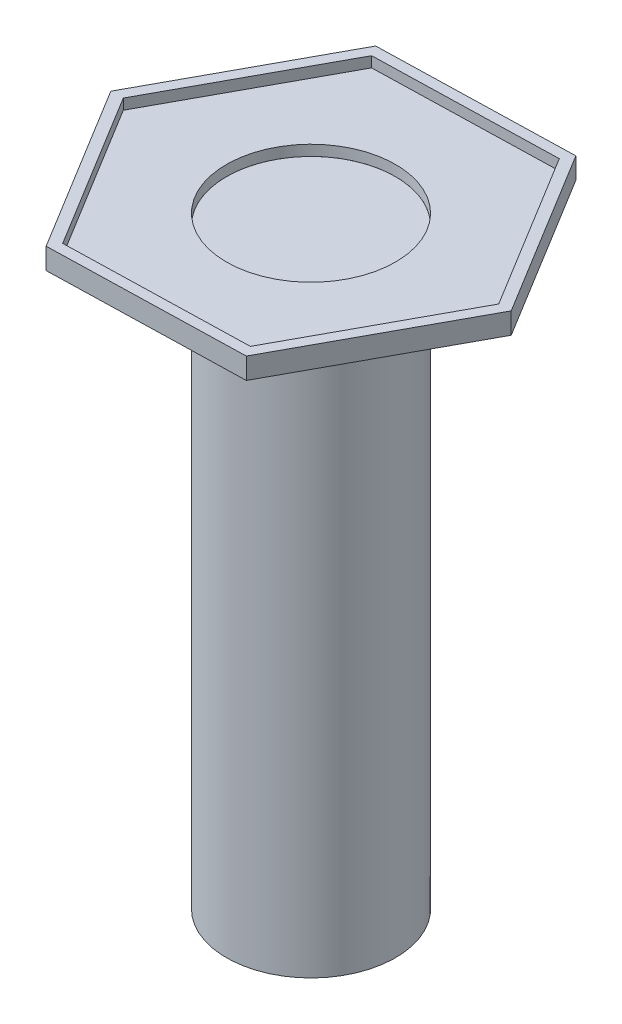
ISO-10303-21;
HEADER;
FILE_DESCRIPTION(('STEP AP214'),'2;1');
FILE_NAME('part.step','',(''),(''),'','','');
FILE_SCHEMA(('AUTOMOTIVE_DESIGN { 1 0 10303 214 1 1 1 1 }'));
ENDSEC;
DATA;
#1=APPLICATION_CONTEXT('core data for automotive mechanical design processes');
#2=APPLICATION_PROTOCOL_DEFINITION('international standard','automotive_design',2000,#1);
#3=PRODUCT_CONTEXT('',#1,'mechanical');
#4=PRODUCT('Part','Part','',(#3));
#5=PRODUCT_RELATED_PRODUCT_CATEGORY('part','',(#4));
#6=PRODUCT_DEFINITION_FORMATION('','',#4);
#7=PRODUCT_DEFINITION_CONTEXT('part definition',#1,'design');
#8=PRODUCT_DEFINITION('design','',#6,#7);
#9=PRODUCT_DEFINITION_SHAPE('','',#8);
#10=(LENGTH_UNIT() NAMED_UNIT(*) SI_UNIT(.MILLI.,.METRE.));
#11=(NAMED_UNIT(*) PLANE_ANGLE_UNIT() SI_UNIT($,.RADIAN.));
#12=(NAMED_UNIT(*) SI_UNIT($,.STERADIAN.) SOLID_ANGLE_UNIT());
#13=UNCERTAINTY_MEASURE_WITH_UNIT(LENGTH_MEASURE(1.E-05),#10,'distance_accuracy_value','');
#14=(GEOMETRIC_REPRESENTATION_CONTEXT(3) GLOBAL_UNCERTAINTY_ASSIGNED_CONTEXT((#13)) GLOBAL_UNIT_ASSIGNED_CONTEXT((#10,
#11,#12)) REPRESENTATION_CONTEXT('',''));
#15=CARTESIAN_POINT('',(0.,0.,0.));
#16=DIRECTION('',(0.,0.,1.));
#17=DIRECTION('',(1.,0.,0.));
#18=AXIS2_PLACEMENT_3D('',#15,#16,#17);
#19=CARTESIAN_POINT('',(0.,-14.,0.));
#20=DIRECTION('',(0.,1.,0.));
#21=DIRECTION('',(0.,0.,1.));
#22=AXIS2_PLACEMENT_3D('',#19,#20,#21);
#23=CYLINDRICAL_SURFACE('',#22,2.);
#24=CARTESIAN_POINT('',(0.,-14.,0.));
#25=DIRECTION('',(0.,-1.,0.));
#26=DIRECTION('',(0.,0.,-1.));
#27=AXIS2_PLACEMENT_3D('',#24,#25,#26);
#28=CIRCLE('',#27,2.);
#29=CARTESIAN_POINT('',(0.,-14.,-2.));
#30=VERTEX_POINT('',#29);
#31=EDGE_CURVE('E11',#30,#30,#28,.T.);
#32=ORIENTED_EDGE('',*,*,#31,.F.);
#33=EDGE_LOOP('',(#32));
#34=FACE_BOUND('',#33,.T.);
#35=CARTESIAN_POINT('',(0.,0.,0.));
#36=DIRECTION('',(0.,-1.,0.));
#37=DIRECTION('',(0.,0.,-1.));
#38=AXIS2_PLACEMENT_3D('',#35,#36,#37);
#39=CIRCLE('',#38,2.);
#40=CARTESIAN_POINT('',(0.,0.,-2.));
#41=VERTEX_POINT('',#40);
#42=EDGE_CURVE('E49',#41,#41,#39,.T.);
#43=ORIENTED_EDGE('',*,*,#42,.T.);
#44=EDGE_LOOP('',(#43));
#45=FACE_BOUND('',#44,.T.);
#46=ADVANCED_FACE('F46',(#34,#45),#23,.T.);
#47=CARTESIAN_POINT('',(0.,-14.,0.));
#48=DIRECTION('',(0.,-1.,0.));
#49=DIRECTION('',(0.,0.,-1.));
#50=AXIS2_PLACEMENT_3D('',#47,#48,#49);
#51=PLANE('',#50);
#52=ORIENTED_EDGE('',*,*,#31,.T.);
#53=EDGE_LOOP('',(#52));
#54=FACE_BOUND('',#53,.T.);
#55=ADVANCED_FACE('F61',(#54),#51,.T.);
#56=CARTESIAN_POINT('',(0.,0.,0.));
#57=DIRECTION('',(0.,-1.,0.));
#58=DIRECTION('',(0.,0.,-1.));
#59=AXIS2_PLACEMENT_3D('',#56,#57,#58);
#60=PLANE('',#59);
#61=ORIENTED_EDGE('',*,*,#42,.F.);
#62=EDGE_LOOP('',(#61));
#63=FACE_BOUND('',#62,.T.);
#64=ADVANCED_FACE('F59',(#63),#60,.F.);
#65=CLOSED_SHELL('',(#46,#55,#64));
#66=MANIFOLD_SOLID_BREP('B2',#65);
#67=CARTESIAN_POINT('',(2.2066429013016,0.5,-4.05759293663973));
#68=DIRECTION('',(0.025501776174238,0.,0.999674776820921));
#69=DIRECTION('',(0.999674776820921,0.,-0.025501776174238));
#70=AXIS2_PLACEMENT_3D('',#67,#68,#69);
#71=PLANE('',#70);
#72=DIRECTION('',(-0.999674776820922,0.,0.025501776174238));
#73=VECTOR('',#72,1.);
#74=CARTESIAN_POINT('',(2.2066429013016,0.,-4.05759293663973));
#75=LINE('',#74,#73);
#76=CARTESIAN_POINT('',(2.2066429013016,0.,-4.05759293663973));
#77=VERTEX_POINT('',#76);
#78=CARTESIAN_POINT('',(-2.41065711069551,0.,-3.93980527792765));
#79=VERTEX_POINT('',#78);
#80=EDGE_CURVE('E184',#77,#79,#75,.T.);
#81=ORIENTED_EDGE('',*,*,#80,.T.);
#82=DIRECTION('',(0.,-1.,0.));
#83=VECTOR('',#82,1.);
#84=CARTESIAN_POINT('',(-2.41065711069551,0.5,-3.93980527792765));
#85=LINE('',#84,#83);
#86=CARTESIAN_POINT('',(-2.41065711069551,0.5,-3.93980527792765));
#87=VERTEX_POINT('',#86);
#88=EDGE_CURVE('E44',#87,#79,#85,.T.);
#89=ORIENTED_EDGE('',*,*,#88,.F.);
#90=DIRECTION('',(-0.999674776820922,0.,0.025501776174238));
#91=VECTOR('',#90,1.);
#92=CARTESIAN_POINT('',(2.2066429013016,0.5,-4.05759293663973));
#93=LINE('',#92,#91);
#94=CARTESIAN_POINT('',(2.2066429013016,0.5,-4.05759293663973));
#95=VERTEX_POINT('',#94);
#96=EDGE_CURVE('E196',#95,#87,#93,.T.);
#97=ORIENTED_EDGE('',*,*,#96,.F.);
#98=DIRECTION('',(0.,-1.,0.));
#99=VECTOR('',#98,1.);
#100=CARTESIAN_POINT('',(2.2066429013016,0.5,-4.05759293663973));
#101=LINE('',#100,#99);
#102=EDGE_CURVE('E180',#95,#77,#101,.T.);
#103=ORIENTED_EDGE('',*,*,#102,.T.);
#104=EDGE_LOOP('',(#81,#89,#97,#103));
#105=FACE_BOUND('',#104,.T.);
#106=ADVANCED_FACE('F87',(#105),#71,.F.);
#107=CARTESIAN_POINT('',(-2.41065711069551,0.5,-3.93980527792765));
#108=DIRECTION('',(0.878494640336576,0.,0.477752202401946));
#109=DIRECTION('',(0.477752202401946,0.,-0.878494640336576));
#110=AXIS2_PLACEMENT_3D('',#107,#108,#109);
#111=PLANE('',#110);
#112=DIRECTION('',(-0.477752202401946,0.,0.878494640336576));
#113=VECTOR('',#112,1.);
#114=CARTESIAN_POINT('',(-2.41065711069551,0.,-3.93980527792765));
#115=LINE('',#114,#113);
#116=CARTESIAN_POINT('',(-4.61730001199711,0.,0.117787658712082));
#117=VERTEX_POINT('',#116);
#118=EDGE_CURVE('E187',#79,#117,#115,.T.);
#119=ORIENTED_EDGE('',*,*,#118,.T.);
#120=DIRECTION('',(0.,-1.,0.));
#121=VECTOR('',#120,1.);
#122=CARTESIAN_POINT('',(-4.61730001199711,0.5,0.117787658712082));
#123=LINE('',#122,#121);
#124=CARTESIAN_POINT('',(-4.61730001199711,0.5,0.117787658712082));
#125=VERTEX_POINT('',#124);
#126=EDGE_CURVE('E95',#125,#117,#123,.T.);
#127=ORIENTED_EDGE('',*,*,#126,.F.);
#128=DIRECTION('',(-0.477752202401946,0.,0.878494640336576));
#129=VECTOR('',#128,1.);
#130=CARTESIAN_POINT('',(-2.41065711069551,0.5,-3.93980527792765));
#131=LINE('',#130,#129);
#132=EDGE_CURVE('E146',#87,#125,#131,.T.);
#133=ORIENTED_EDGE('',*,*,#132,.F.);
#134=ORIENTED_EDGE('',*,*,#88,.T.);
#135=EDGE_LOOP('',(#119,#127,#133,#134));
#136=FACE_BOUND('',#135,.T.);
#137=ADVANCED_FACE('F282',(#136),#111,.F.);
#138=CARTESIAN_POINT('',(-4.61730001199711,0.5,0.117787658712082));
#139=DIRECTION('',(0.852992864162338,0.,-0.521922574418976));
#140=DIRECTION('',(-0.521922574418976,0.,-0.852992864162338));
#141=AXIS2_PLACEMENT_3D('',#138,#139,#140);
#142=PLANE('',#141);
#143=DIRECTION('',(0.521922574418976,0.,0.852992864162338));
#144=VECTOR('',#143,1.);
#145=CARTESIAN_POINT('',(-4.61730001199711,0.,0.117787658712082));
#146=LINE('',#145,#144);
#147=CARTESIAN_POINT('',(-2.2066429013016,0.,4.05759293663973));
#148=VERTEX_POINT('',#147);
#149=EDGE_CURVE('E190',#117,#148,#146,.T.);
#150=ORIENTED_EDGE('',*,*,#149,.T.);
#151=DIRECTION('',(0.,-1.,0.));
#152=VECTOR('',#151,1.);
#153=CARTESIAN_POINT('',(-2.2066429013016,0.5,4.05759293663973));
#154=LINE('',#153,#152);
#155=CARTESIAN_POINT('',(-2.2066429013016,0.5,4.05759293663973));
#156=VERTEX_POINT('',#155);
#157=EDGE_CURVE('E175',#156,#148,#154,.T.);
#158=ORIENTED_EDGE('',*,*,#157,.F.);
#159=DIRECTION('',(0.521922574418976,0.,0.852992864162338));
#160=VECTOR('',#159,1.);
#161=CARTESIAN_POINT('',(-4.61730001199711,0.5,0.117787658712082));
#162=LINE('',#161,#160);
#163=EDGE_CURVE('E163',#125,#156,#162,.T.);
#164=ORIENTED_EDGE('',*,*,#163,.F.);
#165=ORIENTED_EDGE('',*,*,#126,.T.);
#166=EDGE_LOOP('',(#150,#158,#164,#165));
#167=FACE_BOUND('',#166,.T.);
#168=ADVANCED_FACE('F203',(#167),#142,.F.);
#169=CARTESIAN_POINT('',(-2.2066429013016,0.5,4.05759293663973));
#170=DIRECTION('',(-0.0255017761742385,0.,-0.999674776820922));
#171=DIRECTION('',(-0.999674776820922,0.,0.0255017761742385));
#172=AXIS2_PLACEMENT_3D('',#169,#170,#171);
#173=PLANE('',#172);
#174=DIRECTION('',(0.999674776820921,0.,-0.0255017761742385));
#175=VECTOR('',#174,1.);
#176=CARTESIAN_POINT('',(-2.2066429013016,0.,4.05759293663973));
#177=LINE('',#176,#175);
#178=CARTESIAN_POINT('',(2.41065711069551,0.,3.93980527792765));
#179=VERTEX_POINT('',#178);
#180=EDGE_CURVE('E172',#148,#179,#177,.T.);
#181=ORIENTED_EDGE('',*,*,#180,.T.);
#182=DIRECTION('',(0.,-1.,0.));
#183=VECTOR('',#182,1.);
#184=CARTESIAN_POINT('',(2.41065711069551,0.5,3.93980527792765));
#185=LINE('',#184,#183);
#186=CARTESIAN_POINT('',(2.41065711069551,0.5,3.93980527792765));
#187=VERTEX_POINT('',#186);
#188=EDGE_CURVE('E169',#187,#179,#185,.T.);
#189=ORIENTED_EDGE('',*,*,#188,.F.);
#190=DIRECTION('',(0.999674776820921,0.,-0.0255017761742385));
#191=VECTOR('',#190,1.);
#192=CARTESIAN_POINT('',(-2.2066429013016,0.5,4.05759293663973));
#193=LINE('',#192,#191);
#194=EDGE_CURVE('E156',#156,#187,#193,.T.);
#195=ORIENTED_EDGE('',*,*,#194,.F.);
#196=ORIENTED_EDGE('',*,*,#157,.T.);
#197=EDGE_LOOP('',(#181,#189,#195,#196));
#198=FACE_BOUND('',#197,.T.);
#199=ADVANCED_FACE('F170',(#198),#173,.F.);
#200=CARTESIAN_POINT('',(2.41065711069551,0.5,3.93980527792765));
#201=DIRECTION('',(-0.878494640336576,0.,-0.477752202401946));
#202=DIRECTION('',(-0.477752202401946,0.,0.878494640336576));
#203=AXIS2_PLACEMENT_3D('',#200,#201,#202);
#204=PLANE('',#203);
#205=DIRECTION('',(0.477752202401946,0.,-0.878494640336576));
#206=VECTOR('',#205,1.);
#207=CARTESIAN_POINT('',(2.41065711069551,0.,3.93980527792765));
#208=LINE('',#207,#206);
#209=CARTESIAN_POINT('',(4.61730001199711,0.,-0.117787658712082));
#210=VERTEX_POINT('',#209);
#211=EDGE_CURVE('E193',#179,#210,#208,.T.);
#212=ORIENTED_EDGE('',*,*,#211,.T.);
#213=DIRECTION('',(0.,-1.,0.));
#214=VECTOR('',#213,1.);
#215=CARTESIAN_POINT('',(4.61730001199711,0.5,-0.117787658712082));
#216=LINE('',#215,#214);
#217=CARTESIAN_POINT('',(4.61730001199711,0.5,-0.117787658712082));
#218=VERTEX_POINT('',#217);
#219=EDGE_CURVE('E176',#218,#210,#216,.T.);
#220=ORIENTED_EDGE('',*,*,#219,.F.);
#221=DIRECTION('',(0.477752202401946,0.,-0.878494640336576));
#222=VECTOR('',#221,1.);
#223=CARTESIAN_POINT('',(2.41065711069551,0.5,3.93980527792765));
#224=LINE('',#223,#222);
#225=EDGE_CURVE('E160',#187,#218,#224,.T.);
#226=ORIENTED_EDGE('',*,*,#225,.F.);
#227=ORIENTED_EDGE('',*,*,#188,.T.);
#228=EDGE_LOOP('',(#212,#220,#226,#227));
#229=FACE_BOUND('',#228,.T.);
#230=ADVANCED_FACE('F178',(#229),#204,.F.);
#231=CARTESIAN_POINT('',(4.61730001199711,0.5,-0.117787658712082));
#232=DIRECTION('',(-0.852992864162338,0.,0.521922574418976));
#233=DIRECTION('',(0.521922574418976,0.,0.852992864162338));
#234=AXIS2_PLACEMENT_3D('',#231,#232,#233);
#235=PLANE('',#234);
#236=DIRECTION('',(-0.521922574418976,0.,-0.852992864162338));
#237=VECTOR('',#236,1.);
#238=CARTESIAN_POINT('',(4.61730001199711,0.,-0.117787658712082));
#239=LINE('',#238,#237);
#240=EDGE_CURVE('E138',#210,#77,#239,.T.);
#241=ORIENTED_EDGE('',*,*,#240,.T.);
#242=ORIENTED_EDGE('',*,*,#102,.F.);
#243=DIRECTION('',(-0.521922574418976,0.,-0.852992864162338));
#244=VECTOR('',#243,1.);
#245=CARTESIAN_POINT('',(4.61730001199711,0.5,-0.117787658712082));
#246=LINE('',#245,#244);
#247=EDGE_CURVE('E111',#218,#95,#246,.T.);
#248=ORIENTED_EDGE('',*,*,#247,.F.);
#249=ORIENTED_EDGE('',*,*,#219,.T.);
#250=EDGE_LOOP('',(#241,#242,#248,#249));
#251=FACE_BOUND('',#250,.T.);
#252=ADVANCED_FACE('F207',(#251),#235,.F.);
#253=CARTESIAN_POINT('',(0.,0.5,0.));
#254=DIRECTION('',(0.,1.,0.));
#255=DIRECTION('',(0.,0.,1.));
#256=AXIS2_PLACEMENT_3D('',#253,#254,#255);
#257=PLANE('',#256);
#258=DIRECTION('',(0.477752202401946,0.,-0.878494640336576));
#259=VECTOR('',#258,1.);
#260=CARTESIAN_POINT('',(2.25999104127704,0.5,3.69356744805717));
#261=LINE('',#260,#259);
#262=CARTESIAN_POINT('',(2.25999104127704,0.5,3.69356744805717));
#263=VERTEX_POINT('',#262);
#264=CARTESIAN_POINT('',(4.32871876124729,0.5,-0.110425930042577));
#265=VERTEX_POINT('',#264);
#266=EDGE_CURVE('E102',#263,#265,#261,.T.);
#267=ORIENTED_EDGE('',*,*,#266,.F.);
#268=DIRECTION('',(0.999674776820921,0.,-0.0255017761742386));
#269=VECTOR('',#268,1.);
#270=CARTESIAN_POINT('',(-2.06872771997025,0.5,3.80399337809975));
#271=LINE('',#270,#269);
#272=CARTESIAN_POINT('',(-2.06872771997025,0.5,3.80399337809975));
#273=VERTEX_POINT('',#272);
#274=EDGE_CURVE('E230',#273,#263,#271,.T.);
#275=ORIENTED_EDGE('',*,*,#274,.F.);
#276=DIRECTION('',(0.521922574418976,0.,0.852992864162338));
#277=VECTOR('',#276,1.);
#278=CARTESIAN_POINT('',(-4.32871876124729,0.5,0.110425930042577));
#279=LINE('',#278,#277);
#280=CARTESIAN_POINT('',(-4.32871876124729,0.5,0.110425930042577));
#281=VERTEX_POINT('',#280);
#282=EDGE_CURVE('E234',#281,#273,#279,.T.);
#283=ORIENTED_EDGE('',*,*,#282,.F.);
#284=DIRECTION('',(-0.477752202401946,0.,0.878494640336576));
#285=VECTOR('',#284,1.);
#286=CARTESIAN_POINT('',(-2.25999104127704,0.5,-3.69356744805717));
#287=LINE('',#286,#285);
#288=CARTESIAN_POINT('',(-2.25999104127704,0.5,-3.69356744805717));
#289=VERTEX_POINT('',#288);
#290=EDGE_CURVE('E237',#289,#281,#287,.T.);
#291=ORIENTED_EDGE('',*,*,#290,.F.);
#292=DIRECTION('',(-0.999674776820921,0.,0.025501776174238));
#293=VECTOR('',#292,1.);
#294=CARTESIAN_POINT('',(2.06872771997025,0.5,-3.80399337809975));
#295=LINE('',#294,#293);
#296=CARTESIAN_POINT('',(2.06872771997025,0.5,-3.80399337809975));
#297=VERTEX_POINT('',#296);
#298=EDGE_CURVE('E240',#297,#289,#295,.T.);
#299=ORIENTED_EDGE('',*,*,#298,.F.);
#300=DIRECTION('',(-0.521922574418976,0.,-0.852992864162338));
#301=VECTOR('',#300,1.);
#302=CARTESIAN_POINT('',(4.32871876124729,0.5,-0.110425930042576));
#303=LINE('',#302,#301);
#304=EDGE_CURVE('E243',#265,#297,#303,.T.);
#305=ORIENTED_EDGE('',*,*,#304,.F.);
#306=EDGE_LOOP('',(#267,#275,#283,#291,#299,#305));
#307=FACE_BOUND('',#306,.T.);
#308=ORIENTED_EDGE('',*,*,#96,.T.);
#309=ORIENTED_EDGE('',*,*,#132,.T.);
#310=ORIENTED_EDGE('',*,*,#163,.T.);
#311=ORIENTED_EDGE('',*,*,#194,.T.);
#312=ORIENTED_EDGE('',*,*,#225,.T.);
#313=ORIENTED_EDGE('',*,*,#247,.T.);
#314=EDGE_LOOP('',(#308,#309,#310,#311,#312,#313));
#315=FACE_BOUND('',#314,.T.);
#316=ADVANCED_FACE('F158',(#307,#315),#257,.T.);
#317=CARTESIAN_POINT('',(0.,0.,0.));
#318=DIRECTION('',(0.,1.,0.));
#319=DIRECTION('',(0.,0.,1.));
#320=AXIS2_PLACEMENT_3D('',#317,#318,#319);
#321=PLANE('',#320);
#322=CARTESIAN_POINT('',(0.,0.,0.));
#323=DIRECTION('',(0.,1.,0.));
#324=DIRECTION('',(0.,0.,1.));
#325=AXIS2_PLACEMENT_3D('',#322,#323,#324);
#326=CIRCLE('',#325,2.);
#327=CARTESIAN_POINT('',(0.,0.,2.));
#328=VERTEX_POINT('',#327);
#329=EDGE_CURVE('E90',#328,#328,#326,.T.);
#330=ORIENTED_EDGE('',*,*,#329,.T.);
#331=EDGE_LOOP('',(#330));
#332=FACE_BOUND('',#331,.T.);
#333=ORIENTED_EDGE('',*,*,#80,.F.);
#334=ORIENTED_EDGE('',*,*,#240,.F.);
#335=ORIENTED_EDGE('',*,*,#211,.F.);
#336=ORIENTED_EDGE('',*,*,#180,.F.);
#337=ORIENTED_EDGE('',*,*,#149,.F.);
#338=ORIENTED_EDGE('',*,*,#118,.F.);
#339=EDGE_LOOP('',(#333,#334,#335,#336,#337,#338));
#340=FACE_BOUND('',#339,.T.);
#341=ADVANCED_FACE('F206',(#332,#340),#321,.F.);
#342=CARTESIAN_POINT('',(2.25999104127704,0.25,3.69356744805717));
#343=DIRECTION('',(0.878494640336576,0.,0.477752202401946));
#344=DIRECTION('',(0.477752202401946,0.,-0.878494640336576));
#345=AXIS2_PLACEMENT_3D('',#342,#343,#344);
#346=PLANE('',#345);
#347=ORIENTED_EDGE('',*,*,#266,.T.);
#348=DIRECTION('',(0.,1.,0.));
#349=VECTOR('',#348,1.);
#350=CARTESIAN_POINT('',(4.32871876124729,0.25,-0.110425930042576));
#351=LINE('',#350,#349);
#352=CARTESIAN_POINT('',(4.32871876124729,0.25,-0.110425930042576));
#353=VERTEX_POINT('',#352);
#354=EDGE_CURVE('E214',#353,#265,#351,.T.);
#355=ORIENTED_EDGE('',*,*,#354,.F.);
#356=DIRECTION('',(0.477752202401946,0.,-0.878494640336576));
#357=VECTOR('',#356,1.);
#358=CARTESIAN_POINT('',(2.25999104127704,0.25,3.69356744805717));
#359=LINE('',#358,#357);
#360=CARTESIAN_POINT('',(2.25999104127704,0.25,3.69356744805717));
#361=VERTEX_POINT('',#360);
#362=EDGE_CURVE('E233',#361,#353,#359,.T.);
#363=ORIENTED_EDGE('',*,*,#362,.F.);
#364=DIRECTION('',(0.,1.,0.));
#365=VECTOR('',#364,1.);
#366=CARTESIAN_POINT('',(2.25999104127704,0.25,3.69356744805717));
#367=LINE('',#366,#365);
#368=EDGE_CURVE('E188',#361,#263,#367,.T.);
#369=ORIENTED_EDGE('',*,*,#368,.T.);
#370=EDGE_LOOP('',(#347,#355,#363,#369));
#371=FACE_BOUND('',#370,.T.);
#372=ADVANCED_FACE('F299',(#371),#346,.F.);
#373=CARTESIAN_POINT('',(-2.06872771997025,0.25,3.80399337809975));
#374=DIRECTION('',(0.0255017761742386,0.,0.999674776820922));
#375=DIRECTION('',(0.999674776820922,0.,-0.0255017761742386));
#376=AXIS2_PLACEMENT_3D('',#373,#374,#375);
#377=PLANE('',#376);
#378=ORIENTED_EDGE('',*,*,#274,.T.);
#379=ORIENTED_EDGE('',*,*,#368,.F.);
#380=DIRECTION('',(0.999674776820921,0.,-0.0255017761742386));
#381=VECTOR('',#380,1.);
#382=CARTESIAN_POINT('',(-2.06872771997025,0.25,3.80399337809975));
#383=LINE('',#382,#381);
#384=CARTESIAN_POINT('',(-2.06872771997025,0.25,3.80399337809975));
#385=VERTEX_POINT('',#384);
#386=EDGE_CURVE('E217',#385,#361,#383,.T.);
#387=ORIENTED_EDGE('',*,*,#386,.F.);
#388=DIRECTION('',(0.,1.,0.));
#389=VECTOR('',#388,1.);
#390=CARTESIAN_POINT('',(-2.06872771997025,0.25,3.80399337809975));
#391=LINE('',#390,#389);
#392=EDGE_CURVE('E226',#385,#273,#391,.T.);
#393=ORIENTED_EDGE('',*,*,#392,.T.);
#394=EDGE_LOOP('',(#378,#379,#387,#393));
#395=FACE_BOUND('',#394,.T.);
#396=ADVANCED_FACE('F305',(#395),#377,.F.);
#397=CARTESIAN_POINT('',(-4.32871876124729,0.25,0.110425930042577));
#398=DIRECTION('',(-0.852992864162338,0.,0.521922574418976));
#399=DIRECTION('',(0.521922574418976,0.,0.852992864162338));
#400=AXIS2_PLACEMENT_3D('',#397,#398,#399);
#401=PLANE('',#400);
#402=ORIENTED_EDGE('',*,*,#282,.T.);
#403=ORIENTED_EDGE('',*,*,#392,.F.);
#404=DIRECTION('',(0.521922574418976,0.,0.852992864162338));
#405=VECTOR('',#404,1.);
#406=CARTESIAN_POINT('',(-4.32871876124729,0.25,0.110425930042577));
#407=LINE('',#406,#405);
#408=CARTESIAN_POINT('',(-4.32871876124729,0.25,0.110425930042577));
#409=VERTEX_POINT('',#408);
#410=EDGE_CURVE('E249',#409,#385,#407,.T.);
#411=ORIENTED_EDGE('',*,*,#410,.F.);
#412=DIRECTION('',(0.,1.,0.));
#413=VECTOR('',#412,1.);
#414=CARTESIAN_POINT('',(-4.32871876124729,0.25,0.110425930042577));
#415=LINE('',#414,#413);
#416=EDGE_CURVE('E223',#409,#281,#415,.T.);
#417=ORIENTED_EDGE('',*,*,#416,.T.);
#418=EDGE_LOOP('',(#402,#403,#411,#417));
#419=FACE_BOUND('',#418,.T.);
#420=ADVANCED_FACE('F316',(#419),#401,.F.);
#421=CARTESIAN_POINT('',(-2.25999104127704,0.25,-3.69356744805717));
#422=DIRECTION('',(-0.878494640336576,0.,-0.477752202401946));
#423=DIRECTION('',(-0.477752202401946,0.,0.878494640336576));
#424=AXIS2_PLACEMENT_3D('',#421,#422,#423);
#425=PLANE('',#424);
#426=ORIENTED_EDGE('',*,*,#290,.T.);
#427=ORIENTED_EDGE('',*,*,#416,.F.);
#428=DIRECTION('',(-0.477752202401946,0.,0.878494640336576));
#429=VECTOR('',#428,1.);
#430=CARTESIAN_POINT('',(-2.25999104127704,0.25,-3.69356744805717));
#431=LINE('',#430,#429);
#432=CARTESIAN_POINT('',(-2.25999104127704,0.25,-3.69356744805717));
#433=VERTEX_POINT('',#432);
#434=EDGE_CURVE('E252',#433,#409,#431,.T.);
#435=ORIENTED_EDGE('',*,*,#434,.F.);
#436=DIRECTION('',(0.,1.,0.));
#437=VECTOR('',#436,1.);
#438=CARTESIAN_POINT('',(-2.25999104127704,0.25,-3.69356744805717));
#439=LINE('',#438,#437);
#440=EDGE_CURVE('E220',#433,#289,#439,.T.);
#441=ORIENTED_EDGE('',*,*,#440,.T.);
#442=EDGE_LOOP('',(#426,#427,#435,#441));
#443=FACE_BOUND('',#442,.T.);
#444=ADVANCED_FACE('F312',(#443),#425,.F.);
#445=CARTESIAN_POINT('',(2.06872771997025,0.25,-3.80399337809975));
#446=DIRECTION('',(-0.025501776174238,0.,-0.999674776820921));
#447=DIRECTION('',(-0.999674776820921,0.,0.025501776174238));
#448=AXIS2_PLACEMENT_3D('',#445,#446,#447);
#449=PLANE('',#448);
#450=ORIENTED_EDGE('',*,*,#298,.T.);
#451=ORIENTED_EDGE('',*,*,#440,.F.);
#452=DIRECTION('',(-0.999674776820921,0.,0.025501776174238));
#453=VECTOR('',#452,1.);
#454=CARTESIAN_POINT('',(2.06872771997025,0.25,-3.80399337809975));
#455=LINE('',#454,#453);
#456=CARTESIAN_POINT('',(2.06872771997025,0.25,-3.80399337809975));
#457=VERTEX_POINT('',#456);
#458=EDGE_CURVE('E255',#457,#433,#455,.T.);
#459=ORIENTED_EDGE('',*,*,#458,.F.);
#460=DIRECTION('',(0.,1.,0.));
#461=VECTOR('',#460,1.);
#462=CARTESIAN_POINT('',(2.06872771997025,0.25,-3.80399337809975));
#463=LINE('',#462,#461);
#464=EDGE_CURVE('E216',#457,#297,#463,.T.);
#465=ORIENTED_EDGE('',*,*,#464,.T.);
#466=EDGE_LOOP('',(#450,#451,#459,#465));
#467=FACE_BOUND('',#466,.T.);
#468=ADVANCED_FACE('F308',(#467),#449,.F.);
#469=CARTESIAN_POINT('',(4.32871876124729,0.25,-0.110425930042576));
#470=DIRECTION('',(0.852992864162338,0.,-0.521922574418976));
#471=DIRECTION('',(-0.521922574418976,0.,-0.852992864162338));
#472=AXIS2_PLACEMENT_3D('',#469,#470,#471);
#473=PLANE('',#472);
#474=ORIENTED_EDGE('',*,*,#304,.T.);
#475=ORIENTED_EDGE('',*,*,#464,.F.);
#476=DIRECTION('',(-0.521922574418976,0.,-0.852992864162338));
#477=VECTOR('',#476,1.);
#478=CARTESIAN_POINT('',(4.32871876124729,0.25,-0.110425930042576));
#479=LINE('',#478,#477);
#480=EDGE_CURVE('E258',#353,#457,#479,.T.);
#481=ORIENTED_EDGE('',*,*,#480,.F.);
#482=ORIENTED_EDGE('',*,*,#354,.T.);
#483=EDGE_LOOP('',(#474,#475,#481,#482));
#484=FACE_BOUND('',#483,.T.);
#485=ADVANCED_FACE('F278',(#484),#473,.F.);
#486=CARTESIAN_POINT('',(0.,0.25,0.));
#487=DIRECTION('',(0.,1.,0.));
#488=DIRECTION('',(0.,0.,1.));
#489=AXIS2_PLACEMENT_3D('',#486,#487,#488);
#490=PLANE('',#489);
#491=CARTESIAN_POINT('',(0.,0.25,0.));
#492=DIRECTION('',(0.,1.,0.));
#493=DIRECTION('',(0.,0.,1.));
#494=AXIS2_PLACEMENT_3D('',#491,#492,#493);
#495=CIRCLE('',#494,2.);
#496=CARTESIAN_POINT('',(0.,0.25,2.));
#497=VERTEX_POINT('',#496);
#498=EDGE_CURVE('E263',#497,#497,#495,.T.);
#499=ORIENTED_EDGE('',*,*,#498,.F.);
#500=EDGE_LOOP('',(#499));
#501=FACE_BOUND('',#500,.T.);
#502=ORIENTED_EDGE('',*,*,#362,.T.);
#503=ORIENTED_EDGE('',*,*,#480,.T.);
#504=ORIENTED_EDGE('',*,*,#458,.T.);
#505=ORIENTED_EDGE('',*,*,#434,.T.);
#506=ORIENTED_EDGE('',*,*,#410,.T.);
#507=ORIENTED_EDGE('',*,*,#386,.T.);
#508=EDGE_LOOP('',(#502,#503,#504,#505,#506,#507));
#509=FACE_BOUND('',#508,.T.);
#510=ADVANCED_FACE('F273',(#501,#509),#490,.T.);
#511=CARTESIAN_POINT('',(0.,-13.75,0.));
#512=DIRECTION('',(0.,1.,0.));
#513=DIRECTION('',(0.,0.,1.));
#514=AXIS2_PLACEMENT_3D('',#511,#512,#513);
#515=CYLINDRICAL_SURFACE('',#514,2.);
#516=ORIENTED_EDGE('',*,*,#498,.T.);
#517=EDGE_LOOP('',(#516));
#518=FACE_BOUND('',#517,.T.);
#519=ORIENTED_EDGE('',*,*,#329,.F.);
#520=EDGE_LOOP('',(#519));
#521=FACE_BOUND('',#520,.T.);
#522=ADVANCED_FACE('F271',(#518,#521),#515,.F.);
#523=CLOSED_SHELL('',(#106,#137,#168,#199,#230,#252,#316,#341,#372,#396,#420,#444,#468,#485,
#510,#522));
#524=MANIFOLD_SOLID_BREP('B6',#523);
#525=ADVANCED_BREP_SHAPE_REPRESENTATION('',(#18,#66,#524),#14);
#526=SHAPE_DEFINITION_REPRESENTATION(#9,#525);
ENDSEC;
END-ISO-10303-21;
